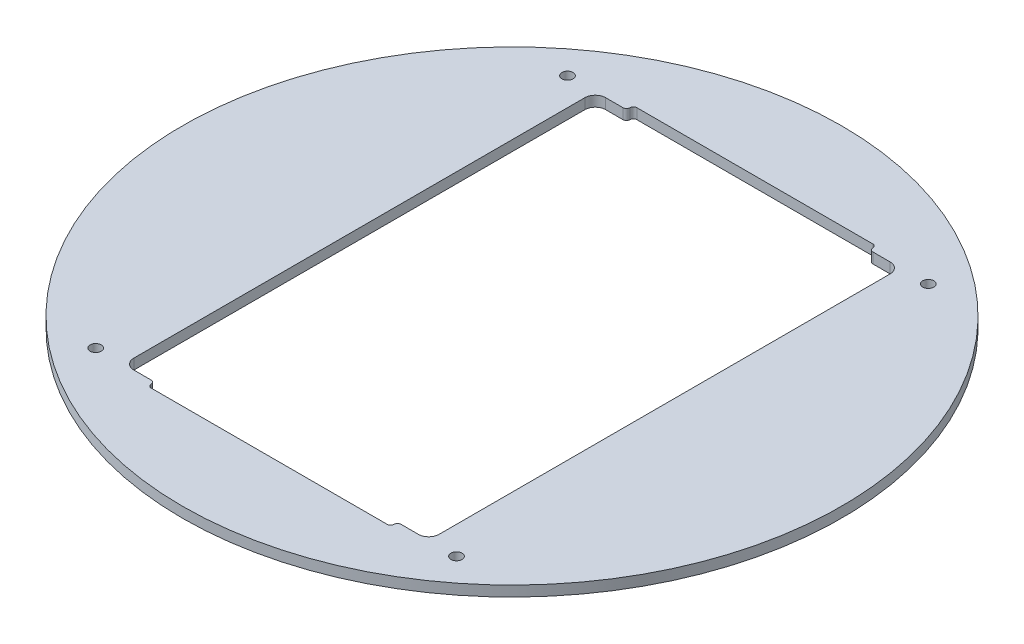
ISO-10303-21;
HEADER;
FILE_DESCRIPTION(('STEP AP214'),'2;1');
FILE_NAME('part.step','',(''),(''),'','','');
FILE_SCHEMA(('AUTOMOTIVE_DESIGN { 1 0 10303 214 1 1 1 1 }'));
ENDSEC;
DATA;
#1=APPLICATION_CONTEXT('core data for automotive mechanical design processes');
#2=APPLICATION_PROTOCOL_DEFINITION('international standard','automotive_design',2000,#1);
#3=PRODUCT_CONTEXT('',#1,'mechanical');
#4=PRODUCT('Part','Part','',(#3));
#5=PRODUCT_RELATED_PRODUCT_CATEGORY('part','',(#4));
#6=PRODUCT_DEFINITION_FORMATION('','',#4);
#7=PRODUCT_DEFINITION_CONTEXT('part definition',#1,'design');
#8=PRODUCT_DEFINITION('design','',#6,#7);
#9=PRODUCT_DEFINITION_SHAPE('','',#8);
#10=(LENGTH_UNIT() NAMED_UNIT(*) SI_UNIT(.MILLI.,.METRE.));
#11=(NAMED_UNIT(*) PLANE_ANGLE_UNIT() SI_UNIT($,.RADIAN.));
#12=(NAMED_UNIT(*) SI_UNIT($,.STERADIAN.) SOLID_ANGLE_UNIT());
#13=UNCERTAINTY_MEASURE_WITH_UNIT(LENGTH_MEASURE(1.E-05),#10,'distance_accuracy_value','');
#14=(GEOMETRIC_REPRESENTATION_CONTEXT(3) GLOBAL_UNCERTAINTY_ASSIGNED_CONTEXT((#13)) GLOBAL_UNIT_ASSIGNED_CONTEXT((#10,
#11,#12)) REPRESENTATION_CONTEXT('',''));
#15=CARTESIAN_POINT('',(0.,0.,0.));
#16=DIRECTION('',(0.,0.,1.));
#17=DIRECTION('',(1.,0.,0.));
#18=AXIS2_PLACEMENT_3D('',#15,#16,#17);
#19=CARTESIAN_POINT('',(-41.,3.,68.));
#20=DIRECTION('',(0.,0.,-1.));
#21=DIRECTION('',(-1.,0.,0.));
#22=AXIS2_PLACEMENT_3D('',#19,#20,#21);
#23=PLANE('',#22);
#24=DIRECTION('',(1.,0.,0.));
#25=VECTOR('',#24,1.);
#26=CARTESIAN_POINT('',(-41.,0.,68.));
#27=LINE('',#26,#25);
#28=CARTESIAN_POINT('',(36.,0.,68.));
#29=VERTEX_POINT('',#28);
#30=CARTESIAN_POINT('',(41.,0.,68.));
#31=VERTEX_POINT('',#30);
#32=EDGE_CURVE('E238',#29,#31,#27,.T.);
#33=ORIENTED_EDGE('',*,*,#32,.F.);
#34=DIRECTION('',(0.,1.,0.));
#35=VECTOR('',#34,1.);
#36=CARTESIAN_POINT('',(36.,3.,68.));
#37=LINE('',#36,#35);
#38=CARTESIAN_POINT('',(36.,3.,68.));
#39=VERTEX_POINT('',#38);
#40=EDGE_CURVE('E327',#29,#39,#37,.T.);
#41=ORIENTED_EDGE('',*,*,#40,.T.);
#42=DIRECTION('',(1.,0.,0.));
#43=VECTOR('',#42,1.);
#44=CARTESIAN_POINT('',(-41.,3.,68.));
#45=LINE('',#44,#43);
#46=CARTESIAN_POINT('',(41.,3.,68.));
#47=VERTEX_POINT('',#46);
#48=EDGE_CURVE('E194',#39,#47,#45,.T.);
#49=ORIENTED_EDGE('',*,*,#48,.T.);
#50=DIRECTION('',(0.,-1.,0.));
#51=VECTOR('',#50,1.);
#52=CARTESIAN_POINT('',(41.,3.,68.));
#53=LINE('',#52,#51);
#54=EDGE_CURVE('E207',#47,#31,#53,.T.);
#55=ORIENTED_EDGE('',*,*,#54,.T.);
#56=EDGE_LOOP('',(#33,#41,#49,#55));
#57=FACE_BOUND('',#56,.T.);
#58=ADVANCED_FACE('F39',(#57),#23,.T.);
#59=CARTESIAN_POINT('',(-41.,3.,-68.));
#60=DIRECTION('',(0.,0.,1.));
#61=DIRECTION('',(1.,0.,0.));
#62=AXIS2_PLACEMENT_3D('',#59,#60,#61);
#63=PLANE('',#62);
#64=DIRECTION('',(-1.,0.,0.));
#65=VECTOR('',#64,1.);
#66=CARTESIAN_POINT('',(-41.,0.,-68.));
#67=LINE('',#66,#65);
#68=CARTESIAN_POINT('',(-36.,0.,-68.));
#69=VERTEX_POINT('',#68);
#70=CARTESIAN_POINT('',(-41.,0.,-68.));
#71=VERTEX_POINT('',#70);
#72=EDGE_CURVE('E251',#69,#71,#67,.T.);
#73=ORIENTED_EDGE('',*,*,#72,.F.);
#74=DIRECTION('',(0.,1.,0.));
#75=VECTOR('',#74,1.);
#76=CARTESIAN_POINT('',(-36.,3.,-68.));
#77=LINE('',#76,#75);
#78=CARTESIAN_POINT('',(-36.,3.,-68.));
#79=VERTEX_POINT('',#78);
#80=EDGE_CURVE('E337',#69,#79,#77,.T.);
#81=ORIENTED_EDGE('',*,*,#80,.T.);
#82=DIRECTION('',(-1.,0.,0.));
#83=VECTOR('',#82,1.);
#84=CARTESIAN_POINT('',(-41.,3.,-68.));
#85=LINE('',#84,#83);
#86=CARTESIAN_POINT('',(-41.,3.,-68.));
#87=VERTEX_POINT('',#86);
#88=EDGE_CURVE('E226',#79,#87,#85,.T.);
#89=ORIENTED_EDGE('',*,*,#88,.T.);
#90=DIRECTION('',(0.,-1.,0.));
#91=VECTOR('',#90,1.);
#92=CARTESIAN_POINT('',(-41.,3.,-68.));
#93=LINE('',#92,#91);
#94=EDGE_CURVE('E263',#87,#71,#93,.T.);
#95=ORIENTED_EDGE('',*,*,#94,.T.);
#96=EDGE_LOOP('',(#73,#81,#89,#95));
#97=FACE_BOUND('',#96,.T.);
#98=ADVANCED_FACE('F376',(#97),#63,.T.);
#99=CARTESIAN_POINT('',(0.,3.,0.));
#100=DIRECTION('',(0.,1.,0.));
#101=DIRECTION('',(0.,0.,1.));
#102=AXIS2_PLACEMENT_3D('',#99,#100,#101);
#103=PLANE('',#102);
#104=DIRECTION('',(1.,0.,0.));
#105=VECTOR('',#104,1.);
#106=CARTESIAN_POINT('',(0.,3.,70.));
#107=LINE('',#106,#105);
#108=CARTESIAN_POINT('',(-34.,3.,70.));
#109=VERTEX_POINT('',#108);
#110=CARTESIAN_POINT('',(34.,3.,70.));
#111=VERTEX_POINT('',#110);
#112=EDGE_CURVE('E239',#109,#111,#107,.T.);
#113=ORIENTED_EDGE('',*,*,#112,.F.);
#114=CARTESIAN_POINT('',(-34.,3.,69.));
#115=DIRECTION('',(0.,1.,0.));
#116=DIRECTION('',(0.,0.,1.));
#117=AXIS2_PLACEMENT_3D('',#114,#115,#116);
#118=CIRCLE('',#117,1.);
#119=CARTESIAN_POINT('',(-35.,3.,69.));
#120=VERTEX_POINT('',#119);
#121=EDGE_CURVE('E342',#109,#120,#118,.F.);
#122=ORIENTED_EDGE('',*,*,#121,.T.);
#123=CARTESIAN_POINT('',(-36.,3.,69.));
#124=DIRECTION('',(0.,1.,0.));
#125=DIRECTION('',(0.,0.,1.));
#126=AXIS2_PLACEMENT_3D('',#123,#124,#125);
#127=CIRCLE('',#126,1.);
#128=CARTESIAN_POINT('',(-36.,3.,68.));
#129=VERTEX_POINT('',#128);
#130=EDGE_CURVE('E213',#120,#129,#127,.T.);
#131=ORIENTED_EDGE('',*,*,#130,.T.);
#132=CARTESIAN_POINT('',(-41.,3.,68.));
#133=VERTEX_POINT('',#132);
#134=EDGE_CURVE('E201',#133,#129,#45,.T.);
#135=ORIENTED_EDGE('',*,*,#134,.F.);
#136=CARTESIAN_POINT('',(-41.,3.,65.));
#137=DIRECTION('',(0.,1.,0.));
#138=DIRECTION('',(0.,0.,1.));
#139=AXIS2_PLACEMENT_3D('',#136,#137,#138);
#140=CIRCLE('',#139,3.);
#141=CARTESIAN_POINT('',(-44.,3.,65.));
#142=VERTEX_POINT('',#141);
#143=EDGE_CURVE('E183',#142,#133,#140,.T.);
#144=ORIENTED_EDGE('',*,*,#143,.F.);
#145=DIRECTION('',(0.,0.,1.));
#146=VECTOR('',#145,1.);
#147=CARTESIAN_POINT('',(-44.,3.,-65.));
#148=LINE('',#147,#146);
#149=CARTESIAN_POINT('',(-44.,3.,-65.));
#150=VERTEX_POINT('',#149);
#151=EDGE_CURVE('E233',#150,#142,#148,.T.);
#152=ORIENTED_EDGE('',*,*,#151,.F.);
#153=CARTESIAN_POINT('',(-41.,3.,-65.));
#154=DIRECTION('',(0.,1.,0.));
#155=DIRECTION('',(0.,0.,-1.));
#156=AXIS2_PLACEMENT_3D('',#153,#154,#155);
#157=CIRCLE('',#156,3.);
#158=EDGE_CURVE('E230',#87,#150,#157,.T.);
#159=ORIENTED_EDGE('',*,*,#158,.F.);
#160=ORIENTED_EDGE('',*,*,#88,.F.);
#161=CARTESIAN_POINT('',(-36.,3.,-69.));
#162=DIRECTION('',(0.,1.,0.));
#163=DIRECTION('',(0.,0.,1.));
#164=AXIS2_PLACEMENT_3D('',#161,#162,#163);
#165=CIRCLE('',#164,1.);
#166=CARTESIAN_POINT('',(-35.,3.,-69.));
#167=VERTEX_POINT('',#166);
#168=EDGE_CURVE('E301',#79,#167,#165,.T.);
#169=ORIENTED_EDGE('',*,*,#168,.T.);
#170=CARTESIAN_POINT('',(-34.,3.,-69.));
#171=DIRECTION('',(0.,1.,0.));
#172=DIRECTION('',(0.,0.,1.));
#173=AXIS2_PLACEMENT_3D('',#170,#171,#172);
#174=CIRCLE('',#173,1.);
#175=CARTESIAN_POINT('',(-34.,3.,-70.));
#176=VERTEX_POINT('',#175);
#177=EDGE_CURVE('E11',#167,#176,#174,.F.);
#178=ORIENTED_EDGE('',*,*,#177,.T.);
#179=DIRECTION('',(1.,0.,0.));
#180=VECTOR('',#179,1.);
#181=CARTESIAN_POINT('',(0.,3.,-70.));
#182=LINE('',#181,#180);
#183=CARTESIAN_POINT('',(34.,3.,-70.));
#184=VERTEX_POINT('',#183);
#185=EDGE_CURVE('E631',#176,#184,#182,.T.);
#186=ORIENTED_EDGE('',*,*,#185,.T.);
#187=CARTESIAN_POINT('',(34.,3.,-69.));
#188=DIRECTION('',(0.,1.,0.));
#189=DIRECTION('',(0.,0.,1.));
#190=AXIS2_PLACEMENT_3D('',#187,#188,#189);
#191=CIRCLE('',#190,1.);
#192=CARTESIAN_POINT('',(35.,3.,-69.));
#193=VERTEX_POINT('',#192);
#194=EDGE_CURVE('E351',#184,#193,#191,.F.);
#195=ORIENTED_EDGE('',*,*,#194,.T.);
#196=CARTESIAN_POINT('',(36.,3.,-69.));
#197=DIRECTION('',(0.,1.,0.));
#198=DIRECTION('',(0.,0.,1.));
#199=AXIS2_PLACEMENT_3D('',#196,#197,#198);
#200=CIRCLE('',#199,1.);
#201=CARTESIAN_POINT('',(36.,3.,-68.));
#202=VERTEX_POINT('',#201);
#203=EDGE_CURVE('E305',#193,#202,#200,.T.);
#204=ORIENTED_EDGE('',*,*,#203,.T.);
#205=CARTESIAN_POINT('',(41.,3.,-68.));
#206=VERTEX_POINT('',#205);
#207=EDGE_CURVE('E227',#206,#202,#85,.T.);
#208=ORIENTED_EDGE('',*,*,#207,.F.);
#209=CARTESIAN_POINT('',(41.,3.,-65.));
#210=DIRECTION('',(0.,1.,0.));
#211=DIRECTION('',(0.,0.,1.));
#212=AXIS2_PLACEMENT_3D('',#209,#210,#211);
#213=CIRCLE('',#212,3.);
#214=CARTESIAN_POINT('',(44.,3.,-65.));
#215=VERTEX_POINT('',#214);
#216=EDGE_CURVE('E224',#215,#206,#213,.T.);
#217=ORIENTED_EDGE('',*,*,#216,.F.);
#218=DIRECTION('',(0.,0.,-1.));
#219=VECTOR('',#218,1.);
#220=CARTESIAN_POINT('',(44.,3.,-65.));
#221=LINE('',#220,#219);
#222=CARTESIAN_POINT('',(44.,3.,65.));
#223=VERTEX_POINT('',#222);
#224=EDGE_CURVE('E219',#223,#215,#221,.T.);
#225=ORIENTED_EDGE('',*,*,#224,.F.);
#226=CARTESIAN_POINT('',(41.,3.,65.));
#227=DIRECTION('',(0.,1.,0.));
#228=DIRECTION('',(0.,0.,-1.));
#229=AXIS2_PLACEMENT_3D('',#226,#227,#228);
#230=CIRCLE('',#229,3.);
#231=EDGE_CURVE('E215',#47,#223,#230,.T.);
#232=ORIENTED_EDGE('',*,*,#231,.F.);
#233=ORIENTED_EDGE('',*,*,#48,.F.);
#234=CARTESIAN_POINT('',(36.,3.,69.));
#235=DIRECTION('',(0.,1.,0.));
#236=DIRECTION('',(0.,0.,1.));
#237=AXIS2_PLACEMENT_3D('',#234,#235,#236);
#238=CIRCLE('',#237,1.);
#239=CARTESIAN_POINT('',(35.,3.,69.));
#240=VERTEX_POINT('',#239);
#241=EDGE_CURVE('E307',#39,#240,#238,.T.);
#242=ORIENTED_EDGE('',*,*,#241,.T.);
#243=CARTESIAN_POINT('',(34.,3.,69.));
#244=DIRECTION('',(0.,1.,0.));
#245=DIRECTION('',(0.,0.,1.));
#246=AXIS2_PLACEMENT_3D('',#243,#244,#245);
#247=CIRCLE('',#246,1.);
#248=EDGE_CURVE('E347',#240,#111,#247,.F.);
#249=ORIENTED_EDGE('',*,*,#248,.T.);
#250=EDGE_LOOP('',(#113,#122,#131,#135,#144,#152,#159,#160,#169,#178,#186,#195,#204,#208,#217,
#225,#232,#233,#242,#249));
#251=FACE_BOUND('',#250,.T.);
#252=CARTESIAN_POINT('',(-52.,3.,68.));
#253=DIRECTION('',(0.,1.,0.));
#254=DIRECTION('',(0.,0.,1.));
#255=AXIS2_PLACEMENT_3D('',#252,#253,#254);
#256=CIRCLE('',#255,1.6);
#257=CARTESIAN_POINT('',(-52.,3.,69.6));
#258=VERTEX_POINT('',#257);
#259=EDGE_CURVE('E280',#258,#258,#256,.T.);
#260=ORIENTED_EDGE('',*,*,#259,.F.);
#261=EDGE_LOOP('',(#260));
#262=FACE_BOUND('',#261,.T.);
#263=CARTESIAN_POINT('',(-52.,3.,-68.));
#264=DIRECTION('',(0.,1.,0.));
#265=DIRECTION('',(0.,0.,1.));
#266=AXIS2_PLACEMENT_3D('',#263,#264,#265);
#267=CIRCLE('',#266,1.59999999999998);
#268=CARTESIAN_POINT('',(-52.,3.,-66.4));
#269=VERTEX_POINT('',#268);
#270=EDGE_CURVE('E292',#269,#269,#267,.T.);
#271=ORIENTED_EDGE('',*,*,#270,.F.);
#272=EDGE_LOOP('',(#271));
#273=FACE_BOUND('',#272,.T.);
#274=CARTESIAN_POINT('',(0.,3.,0.));
#275=DIRECTION('',(0.,1.,0.));
#276=DIRECTION('',(0.,0.,1.));
#277=AXIS2_PLACEMENT_3D('',#274,#275,#276);
#278=CIRCLE('',#277,95.);
#279=CARTESIAN_POINT('',(0.,3.,95.));
#280=VERTEX_POINT('',#279);
#281=EDGE_CURVE('E298',#280,#280,#278,.T.);
#282=ORIENTED_EDGE('',*,*,#281,.T.);
#283=EDGE_LOOP('',(#282));
#284=FACE_BOUND('',#283,.T.);
#285=CARTESIAN_POINT('',(52.,3.,-68.));
#286=DIRECTION('',(0.,1.,0.));
#287=DIRECTION('',(0.,0.,1.));
#288=AXIS2_PLACEMENT_3D('',#285,#286,#287);
#289=CIRCLE('',#288,1.59999999999998);
#290=CARTESIAN_POINT('',(52.,3.,-66.4));
#291=VERTEX_POINT('',#290);
#292=EDGE_CURVE('E286',#291,#291,#289,.T.);
#293=ORIENTED_EDGE('',*,*,#292,.F.);
#294=EDGE_LOOP('',(#293));
#295=FACE_BOUND('',#294,.T.);
#296=CARTESIAN_POINT('',(52.,3.,68.));
#297=DIRECTION('',(0.,1.,0.));
#298=DIRECTION('',(0.,0.,1.));
#299=AXIS2_PLACEMENT_3D('',#296,#297,#298);
#300=CIRCLE('',#299,1.59999999999998);
#301=CARTESIAN_POINT('',(52.,3.,69.6));
#302=VERTEX_POINT('',#301);
#303=EDGE_CURVE('E274',#302,#302,#300,.T.);
#304=ORIENTED_EDGE('',*,*,#303,.F.);
#305=EDGE_LOOP('',(#304));
#306=FACE_BOUND('',#305,.T.);
#307=ADVANCED_FACE('F210',(#251,#262,#273,#284,#295,#306),#103,.T.);
#308=CARTESIAN_POINT('',(0.,0.,0.));
#309=DIRECTION('',(0.,1.,0.));
#310=DIRECTION('',(0.,0.,1.));
#311=AXIS2_PLACEMENT_3D('',#308,#309,#310);
#312=PLANE('',#311);
#313=CARTESIAN_POINT('',(52.,0.,68.));
#314=DIRECTION('',(0.,1.,0.));
#315=DIRECTION('',(0.,0.,1.));
#316=AXIS2_PLACEMENT_3D('',#313,#314,#315);
#317=CIRCLE('',#316,1.59999999999998);
#318=CARTESIAN_POINT('',(52.,0.,69.6));
#319=VERTEX_POINT('',#318);
#320=EDGE_CURVE('E206',#319,#319,#317,.T.);
#321=ORIENTED_EDGE('',*,*,#320,.T.);
#322=EDGE_LOOP('',(#321));
#323=FACE_BOUND('',#322,.T.);
#324=CARTESIAN_POINT('',(-52.,0.,68.));
#325=DIRECTION('',(0.,1.,0.));
#326=DIRECTION('',(0.,0.,1.));
#327=AXIS2_PLACEMENT_3D('',#324,#325,#326);
#328=CIRCLE('',#327,1.6);
#329=CARTESIAN_POINT('',(-52.,0.,69.6));
#330=VERTEX_POINT('',#329);
#331=EDGE_CURVE('E277',#330,#330,#328,.T.);
#332=ORIENTED_EDGE('',*,*,#331,.T.);
#333=EDGE_LOOP('',(#332));
#334=FACE_BOUND('',#333,.T.);
#335=CARTESIAN_POINT('',(52.,0.,-68.));
#336=DIRECTION('',(0.,1.,0.));
#337=DIRECTION('',(0.,0.,1.));
#338=AXIS2_PLACEMENT_3D('',#335,#336,#337);
#339=CIRCLE('',#338,1.59999999999998);
#340=CARTESIAN_POINT('',(52.,0.,-66.4));
#341=VERTEX_POINT('',#340);
#342=EDGE_CURVE('E283',#341,#341,#339,.T.);
#343=ORIENTED_EDGE('',*,*,#342,.T.);
#344=EDGE_LOOP('',(#343));
#345=FACE_BOUND('',#344,.T.);
#346=CARTESIAN_POINT('',(-52.,0.,-68.));
#347=DIRECTION('',(0.,1.,0.));
#348=DIRECTION('',(0.,0.,1.));
#349=AXIS2_PLACEMENT_3D('',#346,#347,#348);
#350=CIRCLE('',#349,1.59999999999998);
#351=CARTESIAN_POINT('',(-52.,0.,-66.4));
#352=VERTEX_POINT('',#351);
#353=EDGE_CURVE('E289',#352,#352,#350,.T.);
#354=ORIENTED_EDGE('',*,*,#353,.T.);
#355=EDGE_LOOP('',(#354));
#356=FACE_BOUND('',#355,.T.);
#357=CARTESIAN_POINT('',(0.,0.,0.));
#358=DIRECTION('',(0.,1.,0.));
#359=DIRECTION('',(0.,0.,1.));
#360=AXIS2_PLACEMENT_3D('',#357,#358,#359);
#361=CIRCLE('',#360,95.);
#362=CARTESIAN_POINT('',(0.,0.,95.));
#363=VERTEX_POINT('',#362);
#364=EDGE_CURVE('E295',#363,#363,#361,.T.);
#365=ORIENTED_EDGE('',*,*,#364,.F.);
#366=EDGE_LOOP('',(#365));
#367=FACE_BOUND('',#366,.T.);
#368=CARTESIAN_POINT('',(-41.,0.,68.));
#369=VERTEX_POINT('',#368);
#370=CARTESIAN_POINT('',(-36.,0.,68.));
#371=VERTEX_POINT('',#370);
#372=EDGE_CURVE('E204',#369,#371,#27,.T.);
#373=ORIENTED_EDGE('',*,*,#372,.T.);
#374=CARTESIAN_POINT('',(-36.,0.,69.));
#375=DIRECTION('',(0.,1.,0.));
#376=DIRECTION('',(0.,0.,1.));
#377=AXIS2_PLACEMENT_3D('',#374,#375,#376);
#378=CIRCLE('',#377,1.);
#379=CARTESIAN_POINT('',(-35.,0.,69.));
#380=VERTEX_POINT('',#379);
#381=EDGE_CURVE('E318',#371,#380,#378,.F.);
#382=ORIENTED_EDGE('',*,*,#381,.T.);
#383=CARTESIAN_POINT('',(-34.,0.,69.));
#384=DIRECTION('',(0.,1.,0.));
#385=DIRECTION('',(0.,0.,1.));
#386=AXIS2_PLACEMENT_3D('',#383,#384,#385);
#387=CIRCLE('',#386,1.);
#388=CARTESIAN_POINT('',(-34.,0.,70.));
#389=VERTEX_POINT('',#388);
#390=EDGE_CURVE('E339',#380,#389,#387,.T.);
#391=ORIENTED_EDGE('',*,*,#390,.T.);
#392=DIRECTION('',(1.,0.,0.));
#393=VECTOR('',#392,1.);
#394=CARTESIAN_POINT('',(0.,0.,70.));
#395=LINE('',#394,#393);
#396=CARTESIAN_POINT('',(34.,0.,70.));
#397=VERTEX_POINT('',#396);
#398=EDGE_CURVE('E634',#389,#397,#395,.T.);
#399=ORIENTED_EDGE('',*,*,#398,.T.);
#400=CARTESIAN_POINT('',(34.,0.,69.));
#401=DIRECTION('',(0.,1.,0.));
#402=DIRECTION('',(0.,0.,1.));
#403=AXIS2_PLACEMENT_3D('',#400,#401,#402);
#404=CIRCLE('',#403,1.);
#405=CARTESIAN_POINT('',(35.,0.,69.));
#406=VERTEX_POINT('',#405);
#407=EDGE_CURVE('E345',#397,#406,#404,.T.);
#408=ORIENTED_EDGE('',*,*,#407,.T.);
#409=CARTESIAN_POINT('',(36.,0.,69.));
#410=DIRECTION('',(0.,1.,0.));
#411=DIRECTION('',(0.,0.,1.));
#412=AXIS2_PLACEMENT_3D('',#409,#410,#411);
#413=CIRCLE('',#412,1.);
#414=EDGE_CURVE('E316',#406,#29,#413,.F.);
#415=ORIENTED_EDGE('',*,*,#414,.T.);
#416=ORIENTED_EDGE('',*,*,#32,.T.);
#417=CARTESIAN_POINT('',(41.,0.,65.));
#418=DIRECTION('',(0.,1.,0.));
#419=DIRECTION('',(0.,0.,-1.));
#420=AXIS2_PLACEMENT_3D('',#417,#418,#419);
#421=CIRCLE('',#420,3.);
#422=CARTESIAN_POINT('',(44.,0.,65.));
#423=VERTEX_POINT('',#422);
#424=EDGE_CURVE('E242',#31,#423,#421,.T.);
#425=ORIENTED_EDGE('',*,*,#424,.T.);
#426=DIRECTION('',(0.,0.,-1.));
#427=VECTOR('',#426,1.);
#428=CARTESIAN_POINT('',(44.,0.,-65.));
#429=LINE('',#428,#427);
#430=CARTESIAN_POINT('',(44.,0.,-65.));
#431=VERTEX_POINT('',#430);
#432=EDGE_CURVE('E245',#423,#431,#429,.T.);
#433=ORIENTED_EDGE('',*,*,#432,.T.);
#434=CARTESIAN_POINT('',(41.,0.,-65.));
#435=DIRECTION('',(0.,1.,0.));
#436=DIRECTION('',(0.,0.,1.));
#437=AXIS2_PLACEMENT_3D('',#434,#435,#436);
#438=CIRCLE('',#437,3.);
#439=CARTESIAN_POINT('',(41.,0.,-68.));
#440=VERTEX_POINT('',#439);
#441=EDGE_CURVE('E248',#431,#440,#438,.T.);
#442=ORIENTED_EDGE('',*,*,#441,.T.);
#443=CARTESIAN_POINT('',(36.,0.,-68.));
#444=VERTEX_POINT('',#443);
#445=EDGE_CURVE('E252',#440,#444,#67,.T.);
#446=ORIENTED_EDGE('',*,*,#445,.T.);
#447=CARTESIAN_POINT('',(36.,0.,-69.));
#448=DIRECTION('',(0.,1.,0.));
#449=DIRECTION('',(0.,0.,1.));
#450=AXIS2_PLACEMENT_3D('',#447,#448,#449);
#451=CIRCLE('',#450,1.);
#452=CARTESIAN_POINT('',(35.,0.,-69.));
#453=VERTEX_POINT('',#452);
#454=EDGE_CURVE('E314',#444,#453,#451,.F.);
#455=ORIENTED_EDGE('',*,*,#454,.T.);
#456=CARTESIAN_POINT('',(34.,0.,-69.));
#457=DIRECTION('',(0.,1.,0.));
#458=DIRECTION('',(0.,0.,1.));
#459=AXIS2_PLACEMENT_3D('',#456,#457,#458);
#460=CIRCLE('',#459,1.);
#461=CARTESIAN_POINT('',(34.,0.,-70.));
#462=VERTEX_POINT('',#461);
#463=EDGE_CURVE('E349',#453,#462,#460,.T.);
#464=ORIENTED_EDGE('',*,*,#463,.T.);
#465=DIRECTION('',(1.,0.,0.));
#466=VECTOR('',#465,1.);
#467=CARTESIAN_POINT('',(0.,0.,-70.));
#468=LINE('',#467,#466);
#469=CARTESIAN_POINT('',(-34.,0.,-70.));
#470=VERTEX_POINT('',#469);
#471=EDGE_CURVE('E357',#470,#462,#468,.T.);
#472=ORIENTED_EDGE('',*,*,#471,.F.);
#473=CARTESIAN_POINT('',(-34.,0.,-69.));
#474=DIRECTION('',(0.,1.,0.));
#475=DIRECTION('',(0.,0.,1.));
#476=AXIS2_PLACEMENT_3D('',#473,#474,#475);
#477=CIRCLE('',#476,1.);
#478=CARTESIAN_POINT('',(-35.,0.,-69.));
#479=VERTEX_POINT('',#478);
#480=EDGE_CURVE('E48',#470,#479,#477,.T.);
#481=ORIENTED_EDGE('',*,*,#480,.T.);
#482=CARTESIAN_POINT('',(-36.,0.,-69.));
#483=DIRECTION('',(0.,1.,0.));
#484=DIRECTION('',(0.,0.,1.));
#485=AXIS2_PLACEMENT_3D('',#482,#483,#484);
#486=CIRCLE('',#485,1.);
#487=EDGE_CURVE('E56',#479,#69,#486,.F.);
#488=ORIENTED_EDGE('',*,*,#487,.T.);
#489=ORIENTED_EDGE('',*,*,#72,.T.);
#490=CARTESIAN_POINT('',(-41.,0.,-65.));
#491=DIRECTION('',(0.,1.,0.));
#492=DIRECTION('',(0.,0.,-1.));
#493=AXIS2_PLACEMENT_3D('',#490,#491,#492);
#494=CIRCLE('',#493,3.);
#495=CARTESIAN_POINT('',(-44.,0.,-65.));
#496=VERTEX_POINT('',#495);
#497=EDGE_CURVE('E255',#71,#496,#494,.T.);
#498=ORIENTED_EDGE('',*,*,#497,.T.);
#499=DIRECTION('',(0.,0.,1.));
#500=VECTOR('',#499,1.);
#501=CARTESIAN_POINT('',(-44.,0.,-65.));
#502=LINE('',#501,#500);
#503=CARTESIAN_POINT('',(-44.,0.,65.));
#504=VERTEX_POINT('',#503);
#505=EDGE_CURVE('E195',#496,#504,#502,.T.);
#506=ORIENTED_EDGE('',*,*,#505,.T.);
#507=CARTESIAN_POINT('',(-41.,0.,65.));
#508=DIRECTION('',(0.,1.,0.));
#509=DIRECTION('',(0.,0.,1.));
#510=AXIS2_PLACEMENT_3D('',#507,#508,#509);
#511=CIRCLE('',#510,3.);
#512=EDGE_CURVE('E235',#504,#369,#511,.T.);
#513=ORIENTED_EDGE('',*,*,#512,.T.);
#514=EDGE_LOOP('',(#373,#382,#391,#399,#408,#415,#416,#425,#433,#442,#446,#455,#464,#472,#481,
#488,#489,#498,#506,#513));
#515=FACE_BOUND('',#514,.T.);
#516=ADVANCED_FACE('F383',(#323,#334,#345,#356,#367,#515),#312,.F.);
#517=CARTESIAN_POINT('',(0.,3.,0.));
#518=DIRECTION('',(0.,-1.,0.));
#519=DIRECTION('',(0.,0.,-1.));
#520=AXIS2_PLACEMENT_3D('',#517,#518,#519);
#521=CYLINDRICAL_SURFACE('',#520,95.);
#522=ORIENTED_EDGE('',*,*,#281,.F.);
#523=EDGE_LOOP('',(#522));
#524=FACE_BOUND('',#523,.T.);
#525=ORIENTED_EDGE('',*,*,#364,.T.);
#526=EDGE_LOOP('',(#525));
#527=FACE_BOUND('',#526,.T.);
#528=ADVANCED_FACE('F437',(#524,#527),#521,.T.);
#529=CARTESIAN_POINT('',(-52.,3.,-68.));
#530=DIRECTION('',(0.,-1.,0.));
#531=DIRECTION('',(0.,0.,-1.));
#532=AXIS2_PLACEMENT_3D('',#529,#530,#531);
#533=CYLINDRICAL_SURFACE('',#532,1.59999999999998);
#534=ORIENTED_EDGE('',*,*,#270,.T.);
#535=EDGE_LOOP('',(#534));
#536=FACE_BOUND('',#535,.T.);
#537=ORIENTED_EDGE('',*,*,#353,.F.);
#538=EDGE_LOOP('',(#537));
#539=FACE_BOUND('',#538,.T.);
#540=ADVANCED_FACE('F433',(#536,#539),#533,.F.);
#541=CARTESIAN_POINT('',(52.,3.,-68.));
#542=DIRECTION('',(0.,-1.,0.));
#543=DIRECTION('',(0.,0.,-1.));
#544=AXIS2_PLACEMENT_3D('',#541,#542,#543);
#545=CYLINDRICAL_SURFACE('',#544,1.59999999999998);
#546=ORIENTED_EDGE('',*,*,#292,.T.);
#547=EDGE_LOOP('',(#546));
#548=FACE_BOUND('',#547,.T.);
#549=ORIENTED_EDGE('',*,*,#342,.F.);
#550=EDGE_LOOP('',(#549));
#551=FACE_BOUND('',#550,.T.);
#552=ADVANCED_FACE('F429',(#548,#551),#545,.F.);
#553=CARTESIAN_POINT('',(-52.,3.,68.));
#554=DIRECTION('',(0.,-1.,0.));
#555=DIRECTION('',(0.,0.,-1.));
#556=AXIS2_PLACEMENT_3D('',#553,#554,#555);
#557=CYLINDRICAL_SURFACE('',#556,1.6);
#558=ORIENTED_EDGE('',*,*,#259,.T.);
#559=EDGE_LOOP('',(#558));
#560=FACE_BOUND('',#559,.T.);
#561=ORIENTED_EDGE('',*,*,#331,.F.);
#562=EDGE_LOOP('',(#561));
#563=FACE_BOUND('',#562,.T.);
#564=ADVANCED_FACE('F423',(#560,#563),#557,.F.);
#565=CARTESIAN_POINT('',(52.,3.,68.));
#566=DIRECTION('',(0.,-1.,0.));
#567=DIRECTION('',(0.,0.,-1.));
#568=AXIS2_PLACEMENT_3D('',#565,#566,#567);
#569=CYLINDRICAL_SURFACE('',#568,1.59999999999998);
#570=ORIENTED_EDGE('',*,*,#303,.T.);
#571=EDGE_LOOP('',(#570));
#572=FACE_BOUND('',#571,.T.);
#573=ORIENTED_EDGE('',*,*,#320,.F.);
#574=EDGE_LOOP('',(#573));
#575=FACE_BOUND('',#574,.T.);
#576=ADVANCED_FACE('F419',(#572,#575),#569,.F.);
#577=CARTESIAN_POINT('',(-41.,3.,65.));
#578=DIRECTION('',(0.,-1.,0.));
#579=DIRECTION('',(0.,0.,-1.));
#580=AXIS2_PLACEMENT_3D('',#577,#578,#579);
#581=CYLINDRICAL_SURFACE('',#580,3.);
#582=ORIENTED_EDGE('',*,*,#512,.F.);
#583=DIRECTION('',(0.,-1.,0.));
#584=VECTOR('',#583,1.);
#585=CARTESIAN_POINT('',(-44.,3.,65.));
#586=LINE('',#585,#584);
#587=EDGE_CURVE('E189',#142,#504,#586,.T.);
#588=ORIENTED_EDGE('',*,*,#587,.F.);
#589=ORIENTED_EDGE('',*,*,#143,.T.);
#590=DIRECTION('',(0.,-1.,0.));
#591=VECTOR('',#590,1.);
#592=CARTESIAN_POINT('',(-41.,3.,68.));
#593=LINE('',#592,#591);
#594=EDGE_CURVE('E186',#133,#369,#593,.T.);
#595=ORIENTED_EDGE('',*,*,#594,.T.);
#596=EDGE_LOOP('',(#582,#588,#589,#595));
#597=FACE_BOUND('',#596,.T.);
#598=ADVANCED_FACE('F185',(#597),#581,.F.);
#599=ORIENTED_EDGE('',*,*,#134,.T.);
#600=DIRECTION('',(0.,1.,0.));
#601=VECTOR('',#600,1.);
#602=CARTESIAN_POINT('',(-36.,0.,68.));
#603=LINE('',#602,#601);
#604=EDGE_CURVE('E311',#129,#371,#603,.F.);
#605=ORIENTED_EDGE('',*,*,#604,.T.);
#606=ORIENTED_EDGE('',*,*,#372,.F.);
#607=ORIENTED_EDGE('',*,*,#594,.F.);
#608=EDGE_LOOP('',(#599,#605,#606,#607));
#609=FACE_BOUND('',#608,.T.);
#610=ADVANCED_FACE('F199',(#609),#23,.T.);
#611=CARTESIAN_POINT('',(41.,3.,65.));
#612=DIRECTION('',(0.,-1.,0.));
#613=DIRECTION('',(0.,0.,-1.));
#614=AXIS2_PLACEMENT_3D('',#611,#612,#613);
#615=CYLINDRICAL_SURFACE('',#614,3.);
#616=ORIENTED_EDGE('',*,*,#424,.F.);
#617=ORIENTED_EDGE('',*,*,#54,.F.);
#618=ORIENTED_EDGE('',*,*,#231,.T.);
#619=DIRECTION('',(0.,-1.,0.));
#620=VECTOR('',#619,1.);
#621=CARTESIAN_POINT('',(44.,3.,65.));
#622=LINE('',#621,#620);
#623=EDGE_CURVE('E270',#223,#423,#622,.T.);
#624=ORIENTED_EDGE('',*,*,#623,.T.);
#625=EDGE_LOOP('',(#616,#617,#618,#624));
#626=FACE_BOUND('',#625,.T.);
#627=ADVANCED_FACE('F410',(#626),#615,.F.);
#628=CARTESIAN_POINT('',(44.,3.,-65.));
#629=DIRECTION('',(-1.,0.,0.));
#630=DIRECTION('',(0.,0.,1.));
#631=AXIS2_PLACEMENT_3D('',#628,#629,#630);
#632=PLANE('',#631);
#633=ORIENTED_EDGE('',*,*,#432,.F.);
#634=ORIENTED_EDGE('',*,*,#623,.F.);
#635=ORIENTED_EDGE('',*,*,#224,.T.);
#636=DIRECTION('',(0.,-1.,0.));
#637=VECTOR('',#636,1.);
#638=CARTESIAN_POINT('',(44.,3.,-65.));
#639=LINE('',#638,#637);
#640=EDGE_CURVE('E268',#215,#431,#639,.T.);
#641=ORIENTED_EDGE('',*,*,#640,.T.);
#642=EDGE_LOOP('',(#633,#634,#635,#641));
#643=FACE_BOUND('',#642,.T.);
#644=ADVANCED_FACE('F416',(#643),#632,.T.);
#645=CARTESIAN_POINT('',(41.,3.,-65.));
#646=DIRECTION('',(0.,-1.,0.));
#647=DIRECTION('',(0.,0.,-1.));
#648=AXIS2_PLACEMENT_3D('',#645,#646,#647);
#649=CYLINDRICAL_SURFACE('',#648,3.);
#650=ORIENTED_EDGE('',*,*,#441,.F.);
#651=ORIENTED_EDGE('',*,*,#640,.F.);
#652=ORIENTED_EDGE('',*,*,#216,.T.);
#653=DIRECTION('',(0.,-1.,0.));
#654=VECTOR('',#653,1.);
#655=CARTESIAN_POINT('',(41.,3.,-68.));
#656=LINE('',#655,#654);
#657=EDGE_CURVE('E266',#206,#440,#656,.T.);
#658=ORIENTED_EDGE('',*,*,#657,.T.);
#659=EDGE_LOOP('',(#650,#651,#652,#658));
#660=FACE_BOUND('',#659,.T.);
#661=ADVANCED_FACE('F537',(#660),#649,.F.);
#662=ORIENTED_EDGE('',*,*,#207,.T.);
#663=DIRECTION('',(0.,1.,0.));
#664=VECTOR('',#663,1.);
#665=CARTESIAN_POINT('',(36.,0.,-68.));
#666=LINE('',#665,#664);
#667=EDGE_CURVE('E329',#202,#444,#666,.F.);
#668=ORIENTED_EDGE('',*,*,#667,.T.);
#669=ORIENTED_EDGE('',*,*,#445,.F.);
#670=ORIENTED_EDGE('',*,*,#657,.F.);
#671=EDGE_LOOP('',(#662,#668,#669,#670));
#672=FACE_BOUND('',#671,.T.);
#673=ADVANCED_FACE('F397',(#672),#63,.T.);
#674=CARTESIAN_POINT('',(-41.,3.,-65.));
#675=DIRECTION('',(0.,-1.,0.));
#676=DIRECTION('',(0.,0.,-1.));
#677=AXIS2_PLACEMENT_3D('',#674,#675,#676);
#678=CYLINDRICAL_SURFACE('',#677,3.);
#679=ORIENTED_EDGE('',*,*,#497,.F.);
#680=ORIENTED_EDGE('',*,*,#94,.F.);
#681=ORIENTED_EDGE('',*,*,#158,.T.);
#682=DIRECTION('',(0.,-1.,0.));
#683=VECTOR('',#682,1.);
#684=CARTESIAN_POINT('',(-44.,3.,-65.));
#685=LINE('',#684,#683);
#686=EDGE_CURVE('E261',#150,#496,#685,.T.);
#687=ORIENTED_EDGE('',*,*,#686,.T.);
#688=EDGE_LOOP('',(#679,#680,#681,#687));
#689=FACE_BOUND('',#688,.T.);
#690=ADVANCED_FACE('F381',(#689),#678,.F.);
#691=CARTESIAN_POINT('',(-44.,3.,-65.));
#692=DIRECTION('',(1.,0.,0.));
#693=DIRECTION('',(0.,0.,-1.));
#694=AXIS2_PLACEMENT_3D('',#691,#692,#693);
#695=PLANE('',#694);
#696=ORIENTED_EDGE('',*,*,#505,.F.);
#697=ORIENTED_EDGE('',*,*,#686,.F.);
#698=ORIENTED_EDGE('',*,*,#151,.T.);
#699=ORIENTED_EDGE('',*,*,#587,.T.);
#700=EDGE_LOOP('',(#696,#697,#698,#699));
#701=FACE_BOUND('',#700,.T.);
#702=ADVANCED_FACE('F385',(#701),#695,.T.);
#703=CARTESIAN_POINT('',(0.,3.,-70.));
#704=DIRECTION('',(0.,0.,-1.));
#705=DIRECTION('',(-1.,0.,0.));
#706=AXIS2_PLACEMENT_3D('',#703,#704,#705);
#707=PLANE('',#706);
#708=ORIENTED_EDGE('',*,*,#471,.T.);
#709=DIRECTION('',(0.,-1.,0.));
#710=VECTOR('',#709,1.);
#711=CARTESIAN_POINT('',(34.,3.,-70.));
#712=LINE('',#711,#710);
#713=EDGE_CURVE('E335',#462,#184,#712,.F.);
#714=ORIENTED_EDGE('',*,*,#713,.T.);
#715=ORIENTED_EDGE('',*,*,#185,.F.);
#716=DIRECTION('',(0.,-1.,0.));
#717=VECTOR('',#716,1.);
#718=CARTESIAN_POINT('',(-34.,3.,-70.));
#719=LINE('',#718,#717);
#720=EDGE_CURVE('E332',#176,#470,#719,.T.);
#721=ORIENTED_EDGE('',*,*,#720,.T.);
#722=EDGE_LOOP('',(#708,#714,#715,#721));
#723=FACE_BOUND('',#722,.T.);
#724=ADVANCED_FACE('F387',(#723),#707,.F.);
#725=CARTESIAN_POINT('',(0.,3.,70.));
#726=DIRECTION('',(0.,0.,-1.));
#727=DIRECTION('',(-1.,0.,0.));
#728=AXIS2_PLACEMENT_3D('',#725,#726,#727);
#729=PLANE('',#728);
#730=ORIENTED_EDGE('',*,*,#398,.F.);
#731=DIRECTION('',(0.,-1.,0.));
#732=VECTOR('',#731,1.);
#733=CARTESIAN_POINT('',(-34.,3.,70.));
#734=LINE('',#733,#732);
#735=EDGE_CURVE('E324',#389,#109,#734,.F.);
#736=ORIENTED_EDGE('',*,*,#735,.T.);
#737=ORIENTED_EDGE('',*,*,#112,.T.);
#738=DIRECTION('',(0.,-1.,0.));
#739=VECTOR('',#738,1.);
#740=CARTESIAN_POINT('',(34.,0.,70.));
#741=LINE('',#740,#739);
#742=EDGE_CURVE('E321',#111,#397,#741,.T.);
#743=ORIENTED_EDGE('',*,*,#742,.T.);
#744=EDGE_LOOP('',(#730,#736,#737,#743));
#745=FACE_BOUND('',#744,.T.);
#746=ADVANCED_FACE('F394',(#745),#729,.T.);
#747=CARTESIAN_POINT('',(-34.,3.,69.));
#748=DIRECTION('',(0.,-1.,0.));
#749=DIRECTION('',(0.,0.,-1.));
#750=AXIS2_PLACEMENT_3D('',#747,#748,#749);
#751=CYLINDRICAL_SURFACE('',#750,1.);
#752=ORIENTED_EDGE('',*,*,#735,.F.);
#753=ORIENTED_EDGE('',*,*,#390,.F.);
#754=DIRECTION('',(0.,-1.,0.));
#755=VECTOR('',#754,1.);
#756=CARTESIAN_POINT('',(-35.,3.,69.));
#757=LINE('',#756,#755);
#758=EDGE_CURVE('E354',#120,#380,#757,.T.);
#759=ORIENTED_EDGE('',*,*,#758,.F.);
#760=ORIENTED_EDGE('',*,*,#121,.F.);
#761=EDGE_LOOP('',(#752,#753,#759,#760));
#762=FACE_BOUND('',#761,.T.);
#763=ADVANCED_FACE('F451',(#762),#751,.F.);
#764=CARTESIAN_POINT('',(-36.,3.,69.));
#765=DIRECTION('',(0.,-1.,0.));
#766=DIRECTION('',(0.,0.,-1.));
#767=AXIS2_PLACEMENT_3D('',#764,#765,#766);
#768=CYLINDRICAL_SURFACE('',#767,1.);
#769=ORIENTED_EDGE('',*,*,#381,.F.);
#770=ORIENTED_EDGE('',*,*,#604,.F.);
#771=ORIENTED_EDGE('',*,*,#130,.F.);
#772=ORIENTED_EDGE('',*,*,#758,.T.);
#773=EDGE_LOOP('',(#769,#770,#771,#772));
#774=FACE_BOUND('',#773,.T.);
#775=ADVANCED_FACE('F447',(#774),#768,.T.);
#776=CARTESIAN_POINT('',(36.,3.,69.));
#777=DIRECTION('',(0.,1.,0.));
#778=DIRECTION('',(0.,0.,1.));
#779=AXIS2_PLACEMENT_3D('',#776,#777,#778);
#780=CYLINDRICAL_SURFACE('',#779,1.);
#781=DIRECTION('',(0.,1.,0.));
#782=VECTOR('',#781,1.);
#783=CARTESIAN_POINT('',(35.,3.,69.));
#784=LINE('',#783,#782);
#785=EDGE_CURVE('E358',#240,#406,#784,.F.);
#786=ORIENTED_EDGE('',*,*,#785,.F.);
#787=ORIENTED_EDGE('',*,*,#241,.F.);
#788=ORIENTED_EDGE('',*,*,#40,.F.);
#789=ORIENTED_EDGE('',*,*,#414,.F.);
#790=EDGE_LOOP('',(#786,#787,#788,#789));
#791=FACE_BOUND('',#790,.T.);
#792=ADVANCED_FACE('F450',(#791),#780,.T.);
#793=CARTESIAN_POINT('',(34.,3.,69.));
#794=DIRECTION('',(0.,1.,0.));
#795=DIRECTION('',(0.,0.,1.));
#796=AXIS2_PLACEMENT_3D('',#793,#794,#795);
#797=CYLINDRICAL_SURFACE('',#796,1.);
#798=ORIENTED_EDGE('',*,*,#248,.F.);
#799=ORIENTED_EDGE('',*,*,#785,.T.);
#800=ORIENTED_EDGE('',*,*,#407,.F.);
#801=ORIENTED_EDGE('',*,*,#742,.F.);
#802=EDGE_LOOP('',(#798,#799,#800,#801));
#803=FACE_BOUND('',#802,.T.);
#804=ADVANCED_FACE('F456',(#803),#797,.F.);
#805=CARTESIAN_POINT('',(34.,3.,-69.));
#806=DIRECTION('',(0.,1.,0.));
#807=DIRECTION('',(0.,0.,1.));
#808=AXIS2_PLACEMENT_3D('',#805,#806,#807);
#809=CYLINDRICAL_SURFACE('',#808,1.);
#810=ORIENTED_EDGE('',*,*,#713,.F.);
#811=ORIENTED_EDGE('',*,*,#463,.F.);
#812=DIRECTION('',(0.,-1.,0.));
#813=VECTOR('',#812,1.);
#814=CARTESIAN_POINT('',(35.,0.,-69.));
#815=LINE('',#814,#813);
#816=EDGE_CURVE('E360',#193,#453,#815,.T.);
#817=ORIENTED_EDGE('',*,*,#816,.F.);
#818=ORIENTED_EDGE('',*,*,#194,.F.);
#819=EDGE_LOOP('',(#810,#811,#817,#818));
#820=FACE_BOUND('',#819,.T.);
#821=ADVANCED_FACE('F459',(#820),#809,.F.);
#822=CARTESIAN_POINT('',(36.,3.,-69.));
#823=DIRECTION('',(0.,-1.,0.));
#824=DIRECTION('',(0.,0.,-1.));
#825=AXIS2_PLACEMENT_3D('',#822,#823,#824);
#826=CYLINDRICAL_SURFACE('',#825,1.);
#827=ORIENTED_EDGE('',*,*,#454,.F.);
#828=ORIENTED_EDGE('',*,*,#667,.F.);
#829=ORIENTED_EDGE('',*,*,#203,.F.);
#830=ORIENTED_EDGE('',*,*,#816,.T.);
#831=EDGE_LOOP('',(#827,#828,#829,#830));
#832=FACE_BOUND('',#831,.T.);
#833=ADVANCED_FACE('F464',(#832),#826,.T.);
#834=CARTESIAN_POINT('',(-36.,3.,-69.));
#835=DIRECTION('',(0.,1.,0.));
#836=DIRECTION('',(0.,0.,1.));
#837=AXIS2_PLACEMENT_3D('',#834,#835,#836);
#838=CYLINDRICAL_SURFACE('',#837,1.);
#839=DIRECTION('',(0.,1.,0.));
#840=VECTOR('',#839,1.);
#841=CARTESIAN_POINT('',(-35.,3.,-69.));
#842=LINE('',#841,#840);
#843=EDGE_CURVE('E43',#167,#479,#842,.F.);
#844=ORIENTED_EDGE('',*,*,#843,.F.);
#845=ORIENTED_EDGE('',*,*,#168,.F.);
#846=ORIENTED_EDGE('',*,*,#80,.F.);
#847=ORIENTED_EDGE('',*,*,#487,.F.);
#848=EDGE_LOOP('',(#844,#845,#846,#847));
#849=FACE_BOUND('',#848,.T.);
#850=ADVANCED_FACE('F41',(#849),#838,.T.);
#851=CARTESIAN_POINT('',(-34.,3.,-69.));
#852=DIRECTION('',(0.,-1.,0.));
#853=DIRECTION('',(0.,0.,-1.));
#854=AXIS2_PLACEMENT_3D('',#851,#852,#853);
#855=CYLINDRICAL_SURFACE('',#854,1.);
#856=ORIENTED_EDGE('',*,*,#177,.F.);
#857=ORIENTED_EDGE('',*,*,#843,.T.);
#858=ORIENTED_EDGE('',*,*,#480,.F.);
#859=ORIENTED_EDGE('',*,*,#720,.F.);
#860=EDGE_LOOP('',(#856,#857,#858,#859));
#861=FACE_BOUND('',#860,.T.);
#862=ADVANCED_FACE('F369',(#861),#855,.F.);
#863=CLOSED_SHELL('',(#58,#98,#307,#516,#528,#540,#552,#564,#576,#598,#610,#627,#644,#661,#673,
#690,#702,#724,#746,#763,#775,#792,#804,#821,#833,#850,#862));
#864=MANIFOLD_SOLID_BREP('B2',#863);
#865=ADVANCED_BREP_SHAPE_REPRESENTATION('',(#18,#864),#14);
#866=SHAPE_DEFINITION_REPRESENTATION(#9,#865);
ENDSEC;
END-ISO-10303-21;
